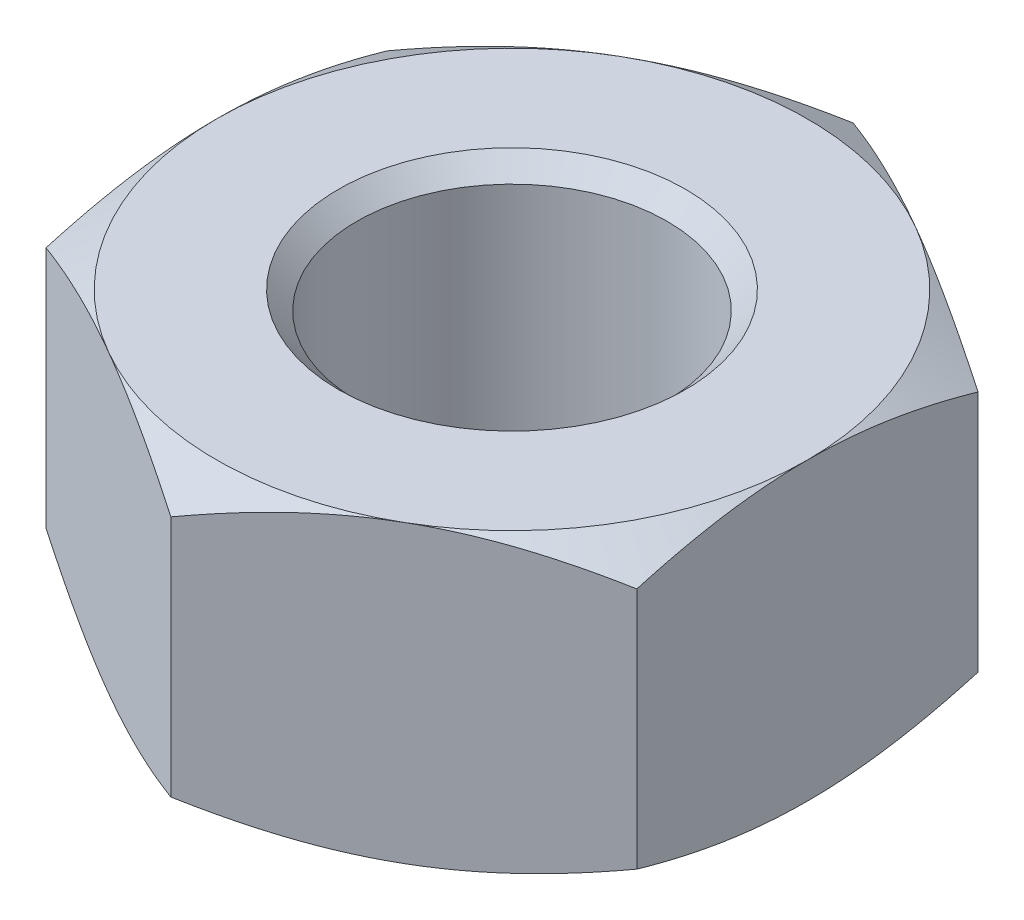
ISO-10303-21;
HEADER;
FILE_DESCRIPTION(('STEP AP214'),'2;1');
FILE_NAME('part.step','',(''),(''),'','','');
FILE_SCHEMA(('AUTOMOTIVE_DESIGN { 1 0 10303 214 1 1 1 1 }'));
ENDSEC;
DATA;
#1=APPLICATION_CONTEXT('core data for automotive mechanical design processes');
#2=APPLICATION_PROTOCOL_DEFINITION('international standard','automotive_design',2000,#1);
#3=PRODUCT_CONTEXT('',#1,'mechanical');
#4=PRODUCT('Part','Part','',(#3));
#5=PRODUCT_RELATED_PRODUCT_CATEGORY('part','',(#4));
#6=PRODUCT_DEFINITION_FORMATION('','',#4);
#7=PRODUCT_DEFINITION_CONTEXT('part definition',#1,'design');
#8=PRODUCT_DEFINITION('design','',#6,#7);
#9=PRODUCT_DEFINITION_SHAPE('','',#8);
#10=(LENGTH_UNIT() NAMED_UNIT(*) SI_UNIT(.MILLI.,.METRE.));
#11=(NAMED_UNIT(*) PLANE_ANGLE_UNIT() SI_UNIT($,.RADIAN.));
#12=(NAMED_UNIT(*) SI_UNIT($,.STERADIAN.) SOLID_ANGLE_UNIT());
#13=UNCERTAINTY_MEASURE_WITH_UNIT(LENGTH_MEASURE(1.E-05),#10,'distance_accuracy_value','');
#14=(GEOMETRIC_REPRESENTATION_CONTEXT(3) GLOBAL_UNCERTAINTY_ASSIGNED_CONTEXT((#13)) GLOBAL_UNIT_ASSIGNED_CONTEXT((#10,
#11,#12)) REPRESENTATION_CONTEXT('',''));
#15=CARTESIAN_POINT('',(0.,0.,0.));
#16=DIRECTION('',(0.,0.,1.));
#17=DIRECTION('',(1.,0.,0.));
#18=AXIS2_PLACEMENT_3D('',#15,#16,#17);
#19=CARTESIAN_POINT('',(0.,-2.,0.));
#20=DIRECTION('',(0.,1.,0.));
#21=DIRECTION('',(0.,0.,1.));
#22=AXIS2_PLACEMENT_3D('',#19,#20,#21);
#23=PLANE('',#22);
#24=CARTESIAN_POINT('',(0.,-2.,0.));
#25=DIRECTION('',(0.,1.,0.));
#26=DIRECTION('',(0.,0.,1.));
#27=AXIS2_PLACEMENT_3D('',#24,#25,#26);
#28=CIRCLE('',#27,2.35);
#29=CARTESIAN_POINT('',(0.,-2.,2.35));
#30=VERTEX_POINT('',#29);
#31=EDGE_CURVE('E12',#30,#30,#28,.T.);
#32=ORIENTED_EDGE('',*,*,#31,.T.);
#33=EDGE_LOOP('',(#32));
#34=FACE_BOUND('',#33,.T.);
#35=CARTESIAN_POINT('',(0.,-2.,0.));
#36=DIRECTION('',(0.,1.,0.));
#37=DIRECTION('',(0.,0.,1.));
#38=AXIS2_PLACEMENT_3D('',#35,#36,#37);
#39=CIRCLE('',#38,4.);
#40=CARTESIAN_POINT('',(2.,-2.,3.46410161513776));
#41=VERTEX_POINT('',#40);
#42=CARTESIAN_POINT('',(-2.,-2.,3.46410161513776));
#43=VERTEX_POINT('',#42);
#44=EDGE_CURVE('E139',#41,#43,#39,.F.);
#45=ORIENTED_EDGE('',*,*,#44,.T.);
#46=CARTESIAN_POINT('',(-4.,-2.,0.));
#47=VERTEX_POINT('',#46);
#48=EDGE_CURVE('E52',#43,#47,#39,.F.);
#49=ORIENTED_EDGE('',*,*,#48,.T.);
#50=CARTESIAN_POINT('',(-2.,-2.,-3.46410161513776));
#51=VERTEX_POINT('',#50);
#52=EDGE_CURVE('E378',#47,#51,#39,.F.);
#53=ORIENTED_EDGE('',*,*,#52,.T.);
#54=CARTESIAN_POINT('',(2.,-2.,-3.46410161513776));
#55=VERTEX_POINT('',#54);
#56=EDGE_CURVE('E380',#51,#55,#39,.F.);
#57=ORIENTED_EDGE('',*,*,#56,.T.);
#58=CARTESIAN_POINT('',(4.,-2.,0.));
#59=VERTEX_POINT('',#58);
#60=EDGE_CURVE('E144',#55,#59,#39,.F.);
#61=ORIENTED_EDGE('',*,*,#60,.T.);
#62=CARTESIAN_POINT('',(0.,-2.,0.));
#63=DIRECTION('',(0.,1.,0.));
#64=DIRECTION('',(0.,0.,1.));
#65=AXIS2_PLACEMENT_3D('',#62,#63,#64);
#66=CIRCLE('',#65,4.);
#67=EDGE_CURVE('E130',#41,#59,#66,.T.);
#68=ORIENTED_EDGE('',*,*,#67,.F.);
#69=EDGE_LOOP('',(#45,#49,#53,#57,#61,#68));
#70=FACE_BOUND('',#69,.T.);
#71=ADVANCED_FACE('F37',(#34,#70),#23,.F.);
#72=CARTESIAN_POINT('',(0.,2.,4.61880215351701));
#73=DIRECTION('',(-0.5,0.,-0.866025403784439));
#74=DIRECTION('',(-0.866025403784439,0.,0.5));
#75=AXIS2_PLACEMENT_3D('',#72,#73,#74);
#76=PLANE('',#75);
#77=DIRECTION('',(0.,-1.,0.));
#78=VECTOR('',#77,1.);
#79=CARTESIAN_POINT('',(0.,2.,4.61880215351701));
#80=LINE('',#79,#78);
#81=CARTESIAN_POINT('',(0.,1.64273441009184,4.61880215351701));
#82=VERTEX_POINT('',#81);
#83=CARTESIAN_POINT('',(0.,-1.64273441009184,4.61880215351701));
#84=VERTEX_POINT('',#83);
#85=EDGE_CURVE('E154',#82,#84,#80,.T.);
#86=ORIENTED_EDGE('',*,*,#85,.T.);
#87=CARTESIAN_POINT('',(-0.000200000000001885,-1.64266774092524,4.61891762357084));
#88=CARTESIAN_POINT('',(0.175579150323226,-1.70128212635172,4.5174314838138));
#89=CARTESIAN_POINT('',(0.352875616326379,-1.75458967853774,4.41506932144052));
#90=CARTESIAN_POINT('',(0.710538593175705,-1.8476383292536,4.20857250547739));
#91=CARTESIAN_POINT('',(0.89091145897015,-1.8873465109703,4.10443418285647));
#92=CARTESIAN_POINT('',(1.24942181870279,-1.94915778471972,3.89744813015756));
#93=CARTESIAN_POINT('',(1.42750415293514,-1.97167226847711,3.79463224655059));
#94=CARTESIAN_POINT('',(1.78450671716651,-1.99854937685342,3.58851671999023));
#95=CARTESIAN_POINT('',(1.9634256496441,-2.00293425857306,3.48521782616117));
#96=CARTESIAN_POINT('',(2.29774284219673,-1.99380992706003,3.29219970504619));
#97=CARTESIAN_POINT('',(2.45319115998706,-1.98254104601201,3.20245157692486));
#98=CARTESIAN_POINT('',(2.76307505563505,-1.94682600920181,3.02354002635497));
#99=CARTESIAN_POINT('',(2.91750956174413,-1.92236765428847,2.93437722268073));
#100=CARTESIAN_POINT('',(3.22803232777458,-1.86122393508071,2.75509682012354));
#101=CARTESIAN_POINT('',(3.3840812880631,-1.82427939634514,2.6650019108942));
#102=CARTESIAN_POINT('',(3.69385183540384,-1.74042992745198,2.48615580200001));
#103=CARTESIAN_POINT('',(3.84757739077378,-1.69354469778726,2.39740231122585));
#104=CARTESIAN_POINT('',(4.0002,-1.64266774092524,2.30928560670467));
#105=B_SPLINE_CURVE_WITH_KNOTS('',3,(#87,#88,#89,#90,#91,#92,#93,#94,#95,#96,#97,#98,#99,#100,
#101,#102,#103,#104),.UNSPECIFIED.,.F.,.F.,(4,2,2,2,2,2,2,2,4),(0.,0.634047835695966,
1.26961969224543,1.88946157213122,2.50854226669297,3.04757825393386,3.58711366126903,
4.13861653143764,4.68903648037743),.UNSPECIFIED.);
#106=EDGE_CURVE('E59',#84,#41,#105,.T.);
#107=ORIENTED_EDGE('',*,*,#106,.T.);
#108=CARTESIAN_POINT('',(4.,-1.64273441009184,2.3094010767585));
#109=VERTEX_POINT('',#108);
#110=EDGE_CURVE('E127',#41,#109,#105,.T.);
#111=ORIENTED_EDGE('',*,*,#110,.T.);
#112=DIRECTION('',(0.,-1.,0.));
#113=VECTOR('',#112,1.);
#114=CARTESIAN_POINT('',(4.,2.,2.3094010767585));
#115=LINE('',#114,#113);
#116=CARTESIAN_POINT('',(4.,1.64273441009184,2.3094010767585));
#117=VERTEX_POINT('',#116);
#118=EDGE_CURVE('E271',#117,#109,#115,.T.);
#119=ORIENTED_EDGE('',*,*,#118,.F.);
#120=CARTESIAN_POINT('',(-0.000200000000001885,1.64266774092524,4.61891762357084));
#121=CARTESIAN_POINT('',(0.175579150323226,1.70128212635172,4.5174314838138));
#122=CARTESIAN_POINT('',(0.352875616326379,1.75458967853774,4.41506932144052));
#123=CARTESIAN_POINT('',(0.710538593175705,1.8476383292536,4.20857250547739));
#124=CARTESIAN_POINT('',(0.89091145897015,1.8873465109703,4.10443418285647));
#125=CARTESIAN_POINT('',(1.24942181870279,1.94915778471972,3.89744813015756));
#126=CARTESIAN_POINT('',(1.42750415293514,1.97167226847711,3.79463224655059));
#127=CARTESIAN_POINT('',(1.78450671716651,1.99854937685342,3.58851671999023));
#128=CARTESIAN_POINT('',(1.9634256496441,2.00293425857306,3.48521782616117));
#129=CARTESIAN_POINT('',(2.29774284219673,1.99380992706003,3.29219970504619));
#130=CARTESIAN_POINT('',(2.45319115998706,1.98254104601201,3.20245157692486));
#131=CARTESIAN_POINT('',(2.76307505563505,1.94682600920181,3.02354002635497));
#132=CARTESIAN_POINT('',(2.91750956174413,1.92236765428847,2.93437722268073));
#133=CARTESIAN_POINT('',(3.22803232777458,1.86122393508071,2.75509682012354));
#134=CARTESIAN_POINT('',(3.3840812880631,1.82427939634514,2.6650019108942));
#135=CARTESIAN_POINT('',(3.69385183540384,1.74042992745198,2.48615580200001));
#136=CARTESIAN_POINT('',(3.84757739077378,1.69354469778726,2.39740231122585));
#137=CARTESIAN_POINT('',(4.0002,1.64266774092524,2.30928560670467));
#138=B_SPLINE_CURVE_WITH_KNOTS('',3,(#120,#121,#122,#123,#124,#125,#126,#127,#128,#129,#130,
#131,#132,#133,#134,#135,#136,#137),.UNSPECIFIED.,.F.,.F.,(4,2,2,2,2,2,2,2,4),(0.,
0.634047835695966,1.26961969224543,1.88946157213122,2.50854226669297,3.04757825393386,
3.58711366126903,4.13861653143764,4.68903648037743),.UNSPECIFIED.);
#139=CARTESIAN_POINT('',(2.,2.,3.46410161513776));
#140=VERTEX_POINT('',#139);
#141=EDGE_CURVE('E251',#140,#117,#138,.T.);
#142=ORIENTED_EDGE('',*,*,#141,.F.);
#143=EDGE_CURVE('E257',#82,#140,#138,.T.);
#144=ORIENTED_EDGE('',*,*,#143,.F.);
#145=EDGE_LOOP('',(#86,#107,#111,#119,#142,#144));
#146=FACE_BOUND('',#145,.T.);
#147=ADVANCED_FACE('F151',(#146),#76,.F.);
#148=CARTESIAN_POINT('',(4.,2.,2.3094010767585));
#149=DIRECTION('',(-1.,0.,0.));
#150=DIRECTION('',(0.,0.,1.));
#151=AXIS2_PLACEMENT_3D('',#148,#149,#150);
#152=PLANE('',#151);
#153=ORIENTED_EDGE('',*,*,#118,.T.);
#154=CARTESIAN_POINT('',(4.,-0.0288542223267847,-6.24253507150389));
#155=CARTESIAN_POINT('',(4.,-0.113932360173933,-6.06747206509902));
#156=CARTESIAN_POINT('',(4.,-0.198205906980998,-5.89201132590408));
#157=CARTESIAN_POINT('',(4.,-0.364691993563113,-5.54008297283565));
#158=CARTESIAN_POINT('',(4.,-0.446904215874516,-5.36361520894607));
#159=CARTESIAN_POINT('',(4.,-0.609220945666707,-5.00857114987515));
#160=CARTESIAN_POINT('',(4.,-0.689311882579765,-4.82998862940935));
#161=CARTESIAN_POINT('',(4.,-0.846267397209191,-4.47141657824296));
#162=CARTESIAN_POINT('',(4.,-0.923132124891703,-4.29142711340472));
#163=CARTESIAN_POINT('',(4.,-1.07522952536281,-3.92384616443088));
#164=CARTESIAN_POINT('',(4.,-1.15032689852421,-3.7361983930778));
#165=CARTESIAN_POINT('',(4.,-1.29493231386766,-3.35872213784876));
#166=CARTESIAN_POINT('',(4.,-1.36443973451876,-3.16889341415324));
#167=CARTESIAN_POINT('',(4.,-1.49606961885141,-2.78709584094415));
#168=CARTESIAN_POINT('',(4.,-1.55820668604455,-2.59513207659198));
#169=CARTESIAN_POINT('',(4.,-1.67312812474441,-2.20845128581282));
#170=CARTESIAN_POINT('',(4.,-1.72591539966408,-2.0137351344438));
#171=CARTESIAN_POINT('',(4.,-1.81935351833355,-1.6225019178267));
#172=CARTESIAN_POINT('',(4.,-1.86007006897343,-1.42600083705216));
#173=CARTESIAN_POINT('',(4.,-1.92708402717112,-1.03051476063685));
#174=CARTESIAN_POINT('',(4.,-1.95338291457808,-0.831530022067316));
#175=CARTESIAN_POINT('',(4.,-1.98912096625145,-0.434686694884085));
#176=CARTESIAN_POINT('',(4.,-1.99878004048414,-0.236848411456635));
#177=CARTESIAN_POINT('',(4.,-2.0010009605766,0.158943217594613));
#178=CARTESIAN_POINT('',(4.,-1.99356243628645,0.356896565616715));
#179=CARTESIAN_POINT('',(4.,-1.96704714718947,0.691762992040419));
#180=CARTESIAN_POINT('',(4.,-1.95217079755403,0.829029781375152));
#181=CARTESIAN_POINT('',(4.,-1.91510141134919,1.10257847106215));
#182=CARTESIAN_POINT('',(4.,-1.89290741586688,1.23886023994309));
#183=CARTESIAN_POINT('',(4.,-1.81651344468562,1.64603164488815));
#184=CARTESIAN_POINT('',(4.,-1.75251433417763,1.91510432935792));
#185=CARTESIAN_POINT('',(4.,-1.64126323703023,2.3175841123597));
#186=CARTESIAN_POINT('',(4.,-1.60109736714564,2.45306878133937));
#187=CARTESIAN_POINT('',(4.,-1.51652881434346,2.72272209792349));
#188=CARTESIAN_POINT('',(4.,-1.47212610040033,2.85689073588298));
#189=CARTESIAN_POINT('',(4.,-1.37980195299892,3.12395458210447));
#190=CARTESIAN_POINT('',(4.,-1.3318816020757,3.25685016802699));
#191=CARTESIAN_POINT('',(4.,-1.23309257979872,3.52153454606914));
#192=CARTESIAN_POINT('',(4.,-1.18222396528534,3.6533233594705));
#193=CARTESIAN_POINT('',(4.,-1.04642408116184,3.9955719317597));
#194=CARTESIAN_POINT('',(4.,-0.959548443520246,4.20525929426535));
#195=CARTESIAN_POINT('',(4.,-0.781004518977472,4.62259071558223));
#196=CARTESIAN_POINT('',(4.,-0.689335783404014,4.83023458093631));
#197=CARTESIAN_POINT('',(4.,-0.502296658272443,5.24391797809677));
#198=CARTESIAN_POINT('',(4.,-0.406925169492595,5.44995701134881));
#199=CARTESIAN_POINT('',(4.,-0.213320613355933,5.86068894916052));
#200=CARTESIAN_POINT('',(4.,-0.11508746719928,6.06538181646098));
#201=CARTESIAN_POINT('',(4.,0.0837750759036593,6.4739539423094));
#202=CARTESIAN_POINT('',(4.,0.184407646290331,6.67783165326032));
#203=CARTESIAN_POINT('',(4.,0.387488026314039,7.08468191049784));
#204=CARTESIAN_POINT('',(4.,0.489935854160734,7.28765444767865));
#205=CARTESIAN_POINT('',(4.,0.799426691521053,7.89537895520692));
#206=CARTESIAN_POINT('',(4.,1.00865600616322,8.29901710933171));
#207=CARTESIAN_POINT('',(4.,1.41006314245613,9.06418978171575));
#208=CARTESIAN_POINT('',(4.,1.60186825842617,9.42592074679159));
#209=CARTESIAN_POINT('',(4.,1.98784897807196,10.1481395650377));
#210=CARTESIAN_POINT('',(4.,2.18202470630567,10.508627351601));
#211=CARTESIAN_POINT('',(4.,2.57154509729339,11.2275405531627));
#212=CARTESIAN_POINT('',(4.,2.76688435231235,11.5859689027755));
#213=CARTESIAN_POINT('',(4.,3.15892632596351,12.3020466558963));
#214=CARTESIAN_POINT('',(4.,3.35562894757915,12.6596961124975));
#215=CARTESIAN_POINT('',(4.,3.55283076312019,13.0170683532049));
#216=B_SPLINE_CURVE_WITH_KNOTS('',3,(#154,#155,#156,#157,#158,#159,#160,#161,#162,#163,#164,
#165,#166,#167,#168,#169,#170,#171,#172,#173,#174,#175,#176,#177,#178,#179,#180,#181,#182,#183,
#184,#185,#186,#187,#188,#189,#190,#191,#192,#193,#194,#195,#196,#197,#198,#199,#200,#201,#202,
#203,#204,#205,#206,#207,#208,#209,#210,#211,#212,#213,#214,#215),.UNSPECIFIED.,.F.,.F.,(4,2,2,
2,2,2,2,2,2,2,2,2,2,2,2,2,2,2,2,2,2,2,2,2,2,2,2,2,2,2,4),(0.,0.58393170000972,1.16795278544889,
1.75508687723558,2.34219364656264,2.94847593937228,3.55482555005801,4.15995293622641,
4.76489208005435,5.36647508549512,5.9679963320474,6.56150514935765,7.15502681580017,
7.5690384845873,7.98310442752669,8.81166523046238,9.23556757547245,9.65947302487097,
10.0832485620448,10.5070159318504,11.1878442978326,11.8687365092864,12.5498324237317,
13.2309471108908,13.9130189642329,14.5950976636207,15.9589900745708,17.1872914028076,
18.4156575492536,19.6402583263854,20.8647728382852),.UNSPECIFIED.);
#217=EDGE_CURVE('E133',#109,#59,#216,.F.);
#218=ORIENTED_EDGE('',*,*,#217,.T.);
#219=CARTESIAN_POINT('',(4.,-1.64273441009184,-2.30940107675851));
#220=VERTEX_POINT('',#219);
#221=EDGE_CURVE('E166',#59,#220,#216,.F.);
#222=ORIENTED_EDGE('',*,*,#221,.T.);
#223=DIRECTION('',(0.,-1.,0.));
#224=VECTOR('',#223,1.);
#225=CARTESIAN_POINT('',(4.,2.,-2.30940107675851));
#226=LINE('',#225,#224);
#227=CARTESIAN_POINT('',(4.,1.64273441009184,-2.30940107675851));
#228=VERTEX_POINT('',#227);
#229=EDGE_CURVE('E268',#228,#220,#226,.T.);
#230=ORIENTED_EDGE('',*,*,#229,.F.);
#231=CARTESIAN_POINT('',(4.,0.0288542223267847,-6.24253507150389));
#232=CARTESIAN_POINT('',(4.,0.113932360173933,-6.06747206509902));
#233=CARTESIAN_POINT('',(4.,0.198205906980998,-5.89201132590408));
#234=CARTESIAN_POINT('',(4.,0.364691993563113,-5.54008297283565));
#235=CARTESIAN_POINT('',(4.,0.446904215874516,-5.36361520894607));
#236=CARTESIAN_POINT('',(4.,0.609220945666707,-5.00857114987515));
#237=CARTESIAN_POINT('',(4.,0.689311882579765,-4.82998862940935));
#238=CARTESIAN_POINT('',(4.,0.846267397209191,-4.47141657824296));
#239=CARTESIAN_POINT('',(4.,0.923132124891703,-4.29142711340472));
#240=CARTESIAN_POINT('',(4.,1.07522952536281,-3.92384616443088));
#241=CARTESIAN_POINT('',(4.,1.15032689852421,-3.7361983930778));
#242=CARTESIAN_POINT('',(4.,1.29493231386766,-3.35872213784876));
#243=CARTESIAN_POINT('',(4.,1.36443973451876,-3.16889341415324));
#244=CARTESIAN_POINT('',(4.,1.49606961885141,-2.78709584094415));
#245=CARTESIAN_POINT('',(4.,1.55820668604455,-2.59513207659198));
#246=CARTESIAN_POINT('',(4.,1.67312812474441,-2.20845128581282));
#247=CARTESIAN_POINT('',(4.,1.72591539966408,-2.0137351344438));
#248=CARTESIAN_POINT('',(4.,1.81935351833355,-1.6225019178267));
#249=CARTESIAN_POINT('',(4.,1.86007006897343,-1.42600083705216));
#250=CARTESIAN_POINT('',(4.,1.92708402717112,-1.03051476063685));
#251=CARTESIAN_POINT('',(4.,1.95338291457808,-0.831530022067316));
#252=CARTESIAN_POINT('',(4.,1.98912096625145,-0.434686694884085));
#253=CARTESIAN_POINT('',(4.,1.99878004048414,-0.236848411456635));
#254=CARTESIAN_POINT('',(4.,2.0010009605766,0.158943217594613));
#255=CARTESIAN_POINT('',(4.,1.99356243628645,0.356896565616715));
#256=CARTESIAN_POINT('',(4.,1.96704714718947,0.691762992040419));
#257=CARTESIAN_POINT('',(4.,1.95217079755403,0.829029781375152));
#258=CARTESIAN_POINT('',(4.,1.91510141134919,1.10257847106215));
#259=CARTESIAN_POINT('',(4.,1.89290741586688,1.23886023994309));
#260=CARTESIAN_POINT('',(4.,1.81651344468562,1.64603164488815));
#261=CARTESIAN_POINT('',(4.,1.75251433417763,1.91510432935792));
#262=CARTESIAN_POINT('',(4.,1.64126323703023,2.3175841123597));
#263=CARTESIAN_POINT('',(4.,1.60109736714564,2.45306878133937));
#264=CARTESIAN_POINT('',(4.,1.51652881434346,2.72272209792349));
#265=CARTESIAN_POINT('',(4.,1.47212610040033,2.85689073588298));
#266=CARTESIAN_POINT('',(4.,1.37980195299892,3.12395458210447));
#267=CARTESIAN_POINT('',(4.,1.3318816020757,3.25685016802699));
#268=CARTESIAN_POINT('',(4.,1.23309257979872,3.52153454606914));
#269=CARTESIAN_POINT('',(4.,1.18222396528534,3.6533233594705));
#270=CARTESIAN_POINT('',(4.,1.04642408116184,3.9955719317597));
#271=CARTESIAN_POINT('',(4.,0.959548443520246,4.20525929426535));
#272=CARTESIAN_POINT('',(4.,0.781004518977472,4.62259071558223));
#273=CARTESIAN_POINT('',(4.,0.689335783404014,4.83023458093631));
#274=CARTESIAN_POINT('',(4.,0.502296658272443,5.24391797809677));
#275=CARTESIAN_POINT('',(4.,0.406925169492595,5.44995701134881));
#276=CARTESIAN_POINT('',(4.,0.213320613355933,5.86068894916052));
#277=CARTESIAN_POINT('',(4.,0.11508746719928,6.06538181646098));
#278=CARTESIAN_POINT('',(4.,-0.0837750759036593,6.4739539423094));
#279=CARTESIAN_POINT('',(4.,-0.184407646290331,6.67783165326032));
#280=CARTESIAN_POINT('',(4.,-0.387488026314039,7.08468191049784));
#281=CARTESIAN_POINT('',(4.,-0.489935854160734,7.28765444767865));
#282=CARTESIAN_POINT('',(4.,-0.799426691521053,7.89537895520692));
#283=CARTESIAN_POINT('',(4.,-1.00865600616322,8.29901710933171));
#284=CARTESIAN_POINT('',(4.,-1.41006314245613,9.06418978171575));
#285=CARTESIAN_POINT('',(4.,-1.60186825842617,9.42592074679159));
#286=CARTESIAN_POINT('',(4.,-1.98784897807196,10.1481395650377));
#287=CARTESIAN_POINT('',(4.,-2.18202470630567,10.508627351601));
#288=CARTESIAN_POINT('',(4.,-2.57154509729339,11.2275405531627));
#289=CARTESIAN_POINT('',(4.,-2.76688435231235,11.5859689027755));
#290=CARTESIAN_POINT('',(4.,-3.15892632596351,12.3020466558963));
#291=CARTESIAN_POINT('',(4.,-3.35562894757915,12.6596961124975));
#292=CARTESIAN_POINT('',(4.,-3.55283076312019,13.0170683532049));
#293=B_SPLINE_CURVE_WITH_KNOTS('',3,(#231,#232,#233,#234,#235,#236,#237,#238,#239,#240,#241,
#242,#243,#244,#245,#246,#247,#248,#249,#250,#251,#252,#253,#254,#255,#256,#257,#258,#259,#260,
#261,#262,#263,#264,#265,#266,#267,#268,#269,#270,#271,#272,#273,#274,#275,#276,#277,#278,#279,
#280,#281,#282,#283,#284,#285,#286,#287,#288,#289,#290,#291,#292),.UNSPECIFIED.,.F.,.F.,(4,2,2,
2,2,2,2,2,2,2,2,2,2,2,2,2,2,2,2,2,2,2,2,2,2,2,2,2,2,2,4),(0.,0.58393170000972,1.16795278544889,
1.75508687723558,2.34219364656264,2.94847593937228,3.55482555005801,4.15995293622641,
4.76489208005435,5.36647508549512,5.9679963320474,6.56150514935765,7.15502681580017,
7.5690384845873,7.98310442752669,8.81166523046238,9.23556757547245,9.65947302487097,
10.0832485620448,10.5070159318504,11.1878442978326,11.8687365092864,12.5498324237317,
13.2309471108908,13.9130189642329,14.5950976636207,15.9589900745708,17.1872914028076,
18.4156575492536,19.6402583263854,20.8647728382852),.UNSPECIFIED.);
#294=CARTESIAN_POINT('',(4.,2.,0.));
#295=VERTEX_POINT('',#294);
#296=EDGE_CURVE('E244',#295,#228,#293,.F.);
#297=ORIENTED_EDGE('',*,*,#296,.F.);
#298=EDGE_CURVE('E250',#117,#295,#293,.F.);
#299=ORIENTED_EDGE('',*,*,#298,.F.);
#300=EDGE_LOOP('',(#153,#218,#222,#230,#297,#299));
#301=FACE_BOUND('',#300,.T.);
#302=ADVANCED_FACE('F223',(#301),#152,.F.);
#303=CARTESIAN_POINT('',(4.,2.,-2.30940107675851));
#304=DIRECTION('',(-0.5,0.,0.866025403784439));
#305=DIRECTION('',(0.866025403784439,0.,0.5));
#306=AXIS2_PLACEMENT_3D('',#303,#304,#305);
#307=PLANE('',#306);
#308=ORIENTED_EDGE('',*,*,#229,.T.);
#309=CARTESIAN_POINT('',(4.0002,-1.64266774092524,-2.30928560670467));
#310=CARTESIAN_POINT('',(3.82442084967677,-1.70128212635172,-2.41077174646171));
#311=CARTESIAN_POINT('',(3.64712438367362,-1.75458967853774,-2.513133908835));
#312=CARTESIAN_POINT('',(3.28946140682429,-1.8476383292536,-2.71963072479812));
#313=CARTESIAN_POINT('',(3.10908854102985,-1.8873465109703,-2.82376904741905));
#314=CARTESIAN_POINT('',(2.75057818129721,-1.94915778471972,-3.03075510011795));
#315=CARTESIAN_POINT('',(2.57249584706486,-1.97167226847711,-3.13357098372492));
#316=CARTESIAN_POINT('',(2.21549328283349,-1.99854937685342,-3.33968651028529));
#317=CARTESIAN_POINT('',(2.0365743503559,-2.00293425857306,-3.44298540411434));
#318=CARTESIAN_POINT('',(1.70225715780327,-1.99380992706003,-3.63600352522933));
#319=CARTESIAN_POINT('',(1.54680884001293,-1.98254104601201,-3.72575165335065));
#320=CARTESIAN_POINT('',(1.23692494436494,-1.94682600920181,-3.90466320392055));
#321=CARTESIAN_POINT('',(1.08249043825587,-1.92236765428847,-3.99382600759479));
#322=CARTESIAN_POINT('',(0.771967672225422,-1.86122393508071,-4.17310641015197));
#323=CARTESIAN_POINT('',(0.615918711936898,-1.82427939634514,-4.26320131938131));
#324=CARTESIAN_POINT('',(0.306148164596162,-1.74042992745197,-4.44204742827551));
#325=CARTESIAN_POINT('',(0.152422609226222,-1.69354469778726,-4.53080091904966));
#326=CARTESIAN_POINT('',(-0.000199999999998291,-1.64266774092523,-4.61891762357085));
#327=B_SPLINE_CURVE_WITH_KNOTS('',3,(#309,#310,#311,#312,#313,#314,#315,#316,#317,#318,#319,
#320,#321,#322,#323,#324,#325,#326),.UNSPECIFIED.,.F.,.F.,(4,2,2,2,2,2,2,2,4),(0.,
0.634047835695966,1.26961969224543,1.88946157213122,2.50854226669297,3.04757825393386,
3.58711366126903,4.13861653143763,4.68903648037743),.UNSPECIFIED.);
#328=EDGE_CURVE('E217',#220,#55,#327,.T.);
#329=ORIENTED_EDGE('',*,*,#328,.T.);
#330=CARTESIAN_POINT('',(0.,-1.64273441009184,-4.61880215351701));
#331=VERTEX_POINT('',#330);
#332=EDGE_CURVE('E210',#55,#331,#327,.T.);
#333=ORIENTED_EDGE('',*,*,#332,.T.);
#334=DIRECTION('',(0.,-1.,0.));
#335=VECTOR('',#334,1.);
#336=CARTESIAN_POINT('',(0.,2.,-4.61880215351701));
#337=LINE('',#336,#335);
#338=CARTESIAN_POINT('',(0.,1.64273441009184,-4.61880215351701));
#339=VERTEX_POINT('',#338);
#340=EDGE_CURVE('E265',#339,#331,#337,.T.);
#341=ORIENTED_EDGE('',*,*,#340,.F.);
#342=CARTESIAN_POINT('',(4.0002,1.64266774092524,-2.30928560670467));
#343=CARTESIAN_POINT('',(3.82442084967677,1.70128212635172,-2.41077174646171));
#344=CARTESIAN_POINT('',(3.64712438367362,1.75458967853774,-2.513133908835));
#345=CARTESIAN_POINT('',(3.28946140682429,1.8476383292536,-2.71963072479812));
#346=CARTESIAN_POINT('',(3.10908854102985,1.8873465109703,-2.82376904741905));
#347=CARTESIAN_POINT('',(2.75057818129721,1.94915778471972,-3.03075510011795));
#348=CARTESIAN_POINT('',(2.57249584706486,1.97167226847711,-3.13357098372492));
#349=CARTESIAN_POINT('',(2.21549328283349,1.99854937685342,-3.33968651028529));
#350=CARTESIAN_POINT('',(2.0365743503559,2.00293425857306,-3.44298540411434));
#351=CARTESIAN_POINT('',(1.70225715780327,1.99380992706003,-3.63600352522933));
#352=CARTESIAN_POINT('',(1.54680884001293,1.98254104601201,-3.72575165335065));
#353=CARTESIAN_POINT('',(1.23692494436494,1.94682600920181,-3.90466320392055));
#354=CARTESIAN_POINT('',(1.08249043825587,1.92236765428847,-3.99382600759479));
#355=CARTESIAN_POINT('',(0.771967672225422,1.86122393508071,-4.17310641015197));
#356=CARTESIAN_POINT('',(0.615918711936898,1.82427939634514,-4.26320131938131));
#357=CARTESIAN_POINT('',(0.306148164596162,1.74042992745197,-4.44204742827551));
#358=CARTESIAN_POINT('',(0.152422609226222,1.69354469778726,-4.53080091904966));
#359=CARTESIAN_POINT('',(-0.000199999999998291,1.64266774092523,-4.61891762357085));
#360=B_SPLINE_CURVE_WITH_KNOTS('',3,(#342,#343,#344,#345,#346,#347,#348,#349,#350,#351,#352,
#353,#354,#355,#356,#357,#358,#359),.UNSPECIFIED.,.F.,.F.,(4,2,2,2,2,2,2,2,4),(0.,
0.634047835695966,1.26961969224543,1.88946157213122,2.50854226669297,3.04757825393386,
3.58711366126903,4.13861653143763,4.68903648037743),.UNSPECIFIED.);
#361=CARTESIAN_POINT('',(2.,2.,-3.46410161513776));
#362=VERTEX_POINT('',#361);
#363=EDGE_CURVE('E229',#362,#339,#360,.T.);
#364=ORIENTED_EDGE('',*,*,#363,.F.);
#365=EDGE_CURVE('E236',#228,#362,#360,.T.);
#366=ORIENTED_EDGE('',*,*,#365,.F.);
#367=EDGE_LOOP('',(#308,#329,#333,#341,#364,#366));
#368=FACE_BOUND('',#367,.T.);
#369=ADVANCED_FACE('F219',(#368),#307,.F.);
#370=CARTESIAN_POINT('',(0.,2.,-4.61880215351701));
#371=DIRECTION('',(0.5,0.,0.866025403784439));
#372=DIRECTION('',(0.866025403784439,0.,-0.5));
#373=AXIS2_PLACEMENT_3D('',#370,#371,#372);
#374=PLANE('',#373);
#375=ORIENTED_EDGE('',*,*,#340,.T.);
#376=CARTESIAN_POINT('',(0.000200000000001413,-1.64266774092523,-4.61891762357085));
#377=CARTESIAN_POINT('',(-0.175579150323227,-1.70128212635172,-4.51743148381381));
#378=CARTESIAN_POINT('',(-0.35287561632638,-1.75458967853774,-4.41506932144052));
#379=CARTESIAN_POINT('',(-0.710538593175706,-1.8476383292536,-4.2085725054774));
#380=CARTESIAN_POINT('',(-0.89091145897015,-1.8873465109703,-4.10443418285647));
#381=CARTESIAN_POINT('',(-1.24942181870279,-1.94915778471972,-3.89744813015756));
#382=CARTESIAN_POINT('',(-1.42750415293514,-1.97167226847711,-3.79463224655059));
#383=CARTESIAN_POINT('',(-1.78450671716651,-1.99854937685342,-3.58851671999023));
#384=CARTESIAN_POINT('',(-1.9634256496441,-2.00293425857306,-3.48521782616117));
#385=CARTESIAN_POINT('',(-2.29774284219673,-1.99380992706003,-3.29219970504619));
#386=CARTESIAN_POINT('',(-2.45319115998707,-1.98254104601201,-3.20245157692487));
#387=CARTESIAN_POINT('',(-2.76307505563506,-1.94682600920181,-3.02354002635497));
#388=CARTESIAN_POINT('',(-2.91750956174413,-1.92236765428847,-2.93437722268073));
#389=CARTESIAN_POINT('',(-3.22803232777458,-1.86122393508071,-2.75509682012354));
#390=CARTESIAN_POINT('',(-3.3840812880631,-1.82427939634514,-2.6650019108942));
#391=CARTESIAN_POINT('',(-3.69385183540384,-1.74042992745197,-2.48615580200001));
#392=CARTESIAN_POINT('',(-3.84757739077378,-1.69354469778726,-2.39740231122585));
#393=CARTESIAN_POINT('',(-4.0002,-1.64266774092523,-2.30928560670467));
#394=B_SPLINE_CURVE_WITH_KNOTS('',3,(#376,#377,#378,#379,#380,#381,#382,#383,#384,#385,#386,
#387,#388,#389,#390,#391,#392,#393),.UNSPECIFIED.,.F.,.F.,(4,2,2,2,2,2,2,2,4),(0.,
0.634047835695966,1.26961969224543,1.88946157213122,2.50854226669297,3.04757825393386,
3.58711366126904,4.13861653143764,4.68903648037743),.UNSPECIFIED.);
#395=EDGE_CURVE('E218',#331,#51,#394,.T.);
#396=ORIENTED_EDGE('',*,*,#395,.T.);
#397=CARTESIAN_POINT('',(-4.,-1.6427344100921,-2.30940107675889));
#398=VERTEX_POINT('',#397);
#399=EDGE_CURVE('E204',#51,#398,#394,.T.);
#400=ORIENTED_EDGE('',*,*,#399,.T.);
#401=DIRECTION('',(0.,-1.,0.));
#402=VECTOR('',#401,1.);
#403=CARTESIAN_POINT('',(-4.,2.,-2.3094010767585));
#404=LINE('',#403,#402);
#405=CARTESIAN_POINT('',(-4.,1.6427344100921,-2.30940107675889));
#406=VERTEX_POINT('',#405);
#407=EDGE_CURVE('E262',#406,#398,#404,.T.);
#408=ORIENTED_EDGE('',*,*,#407,.F.);
#409=CARTESIAN_POINT('',(0.000200000000001413,1.64266774092523,-4.61891762357085));
#410=CARTESIAN_POINT('',(-0.175579150323227,1.70128212635172,-4.51743148381381));
#411=CARTESIAN_POINT('',(-0.35287561632638,1.75458967853774,-4.41506932144052));
#412=CARTESIAN_POINT('',(-0.710538593175706,1.8476383292536,-4.2085725054774));
#413=CARTESIAN_POINT('',(-0.89091145897015,1.8873465109703,-4.10443418285647));
#414=CARTESIAN_POINT('',(-1.24942181870279,1.94915778471972,-3.89744813015756));
#415=CARTESIAN_POINT('',(-1.42750415293514,1.97167226847711,-3.79463224655059));
#416=CARTESIAN_POINT('',(-1.78450671716651,1.99854937685342,-3.58851671999023));
#417=CARTESIAN_POINT('',(-1.9634256496441,2.00293425857306,-3.48521782616117));
#418=CARTESIAN_POINT('',(-2.29774284219673,1.99380992706003,-3.29219970504619));
#419=CARTESIAN_POINT('',(-2.45319115998707,1.98254104601201,-3.20245157692487));
#420=CARTESIAN_POINT('',(-2.76307505563506,1.94682600920181,-3.02354002635497));
#421=CARTESIAN_POINT('',(-2.91750956174413,1.92236765428847,-2.93437722268073));
#422=CARTESIAN_POINT('',(-3.22803232777458,1.86122393508071,-2.75509682012354));
#423=CARTESIAN_POINT('',(-3.3840812880631,1.82427939634514,-2.6650019108942));
#424=CARTESIAN_POINT('',(-3.69385183540384,1.74042992745197,-2.48615580200001));
#425=CARTESIAN_POINT('',(-3.84757739077378,1.69354469778726,-2.39740231122585));
#426=CARTESIAN_POINT('',(-4.0002,1.64266774092523,-2.30928560670467));
#427=B_SPLINE_CURVE_WITH_KNOTS('',3,(#409,#410,#411,#412,#413,#414,#415,#416,#417,#418,#419,
#420,#421,#422,#423,#424,#425,#426),.UNSPECIFIED.,.F.,.F.,(4,2,2,2,2,2,2,2,4),(0.,
0.634047835695966,1.26961969224543,1.88946157213122,2.50854226669297,3.04757825393386,
3.58711366126904,4.13861653143764,4.68903648037743),.UNSPECIFIED.);
#428=CARTESIAN_POINT('',(-2.,2.,-3.46410161513776));
#429=VERTEX_POINT('',#428);
#430=EDGE_CURVE('E238',#429,#406,#427,.T.);
#431=ORIENTED_EDGE('',*,*,#430,.F.);
#432=EDGE_CURVE('E237',#339,#429,#427,.T.);
#433=ORIENTED_EDGE('',*,*,#432,.F.);
#434=EDGE_LOOP('',(#375,#396,#400,#408,#431,#433));
#435=FACE_BOUND('',#434,.T.);
#436=ADVANCED_FACE('F222',(#435),#374,.F.);
#437=CARTESIAN_POINT('',(-4.,2.,-2.3094010767585));
#438=DIRECTION('',(1.,0.,0.));
#439=DIRECTION('',(0.,0.,-1.));
#440=AXIS2_PLACEMENT_3D('',#437,#438,#439);
#441=PLANE('',#440);
#442=ORIENTED_EDGE('',*,*,#407,.T.);
#443=CARTESIAN_POINT('',(-4.,-0.0288542223267843,-6.2425350715039));
#444=CARTESIAN_POINT('',(-4.,-0.113932360173932,-6.06747206509902));
#445=CARTESIAN_POINT('',(-4.,-0.198205906980997,-5.89201132590408));
#446=CARTESIAN_POINT('',(-4.,-0.364691993563113,-5.54008297283565));
#447=CARTESIAN_POINT('',(-4.,-0.446904215874516,-5.36361520894607));
#448=CARTESIAN_POINT('',(-4.,-0.609220945666706,-5.00857114987515));
#449=CARTESIAN_POINT('',(-4.,-0.689311882579764,-4.82998862940935));
#450=CARTESIAN_POINT('',(-4.,-0.84626739720919,-4.47141657824296));
#451=CARTESIAN_POINT('',(-4.,-0.923132124891702,-4.29142711340472));
#452=CARTESIAN_POINT('',(-4.,-1.07522952536281,-3.92384616443088));
#453=CARTESIAN_POINT('',(-4.,-1.15032689852421,-3.7361983930778));
#454=CARTESIAN_POINT('',(-4.,-1.29493231386766,-3.35872213784876));
#455=CARTESIAN_POINT('',(-4.,-1.36443973451876,-3.16889341415324));
#456=CARTESIAN_POINT('',(-4.,-1.49606961885141,-2.78709584094415));
#457=CARTESIAN_POINT('',(-4.,-1.55820668604455,-2.59513207659198));
#458=CARTESIAN_POINT('',(-4.,-1.6731281247444,-2.20845128581281));
#459=CARTESIAN_POINT('',(-4.,-1.72591539966407,-2.0137351344438));
#460=CARTESIAN_POINT('',(-4.,-1.81935351833355,-1.6225019178267));
#461=CARTESIAN_POINT('',(-4.,-1.86007006897343,-1.42600083705216));
#462=CARTESIAN_POINT('',(-4.,-1.92708402717112,-1.03051476063685));
#463=CARTESIAN_POINT('',(-4.,-1.95338291457808,-0.831530022067314));
#464=CARTESIAN_POINT('',(-4.,-1.98912096625145,-0.434686694884083));
#465=CARTESIAN_POINT('',(-4.,-1.99878004048414,-0.236848411456632));
#466=CARTESIAN_POINT('',(-4.,-2.0010009605766,0.158943217594615));
#467=CARTESIAN_POINT('',(-4.,-1.99356243628645,0.356896565616717));
#468=CARTESIAN_POINT('',(-4.,-1.96704714718947,0.691762992040421));
#469=CARTESIAN_POINT('',(-4.,-1.95217079755403,0.829029781375154));
#470=CARTESIAN_POINT('',(-4.,-1.91510141134919,1.10257847106216));
#471=CARTESIAN_POINT('',(-4.,-1.89290741586687,1.2388602399431));
#472=CARTESIAN_POINT('',(-4.,-1.81651344468562,1.64603164488815));
#473=CARTESIAN_POINT('',(-4.,-1.75251433417763,1.91510432935793));
#474=CARTESIAN_POINT('',(-4.,-1.64126323703023,2.31758411235971));
#475=CARTESIAN_POINT('',(-4.,-1.60109736714563,2.45306878133937));
#476=CARTESIAN_POINT('',(-4.,-1.51652881434345,2.72272209792349));
#477=CARTESIAN_POINT('',(-4.,-1.47212610040032,2.85689073588298));
#478=CARTESIAN_POINT('',(-4.,-1.37980195299892,3.12395458210448));
#479=CARTESIAN_POINT('',(-4.,-1.3318816020757,3.256850168027));
#480=CARTESIAN_POINT('',(-4.,-1.23309257979872,3.52153454606915));
#481=CARTESIAN_POINT('',(-4.,-1.18222396528533,3.6533233594705));
#482=CARTESIAN_POINT('',(-4.,-1.04642408116183,3.9955719317597));
#483=CARTESIAN_POINT('',(-4.,-0.959548443520243,4.20525929426535));
#484=CARTESIAN_POINT('',(-4.,-0.781004518977468,4.62259071558224));
#485=CARTESIAN_POINT('',(-4.,-0.68933578340401,4.83023458093632));
#486=CARTESIAN_POINT('',(-4.,-0.502296658272439,5.24391797809677));
#487=CARTESIAN_POINT('',(-4.,-0.406925169492591,5.44995701134881));
#488=CARTESIAN_POINT('',(-4.,-0.213320613355929,5.86068894916053));
#489=CARTESIAN_POINT('',(-4.,-0.115087467199275,6.06538181646099));
#490=CARTESIAN_POINT('',(-4.,0.0837750759036638,6.47395394230941));
#491=CARTESIAN_POINT('',(-4.,0.184407646290335,6.67783165326032));
#492=CARTESIAN_POINT('',(-4.,0.387488026314043,7.08468191049784));
#493=CARTESIAN_POINT('',(-4.,0.489935854160738,7.28765444767865));
#494=CARTESIAN_POINT('',(-4.,0.799426691521056,7.89537895520693));
#495=CARTESIAN_POINT('',(-4.,1.00865600616323,8.29901710933172));
#496=CARTESIAN_POINT('',(-4.,1.41006314245613,9.06418978171576));
#497=CARTESIAN_POINT('',(-4.,1.60186825842617,9.4259207467916));
#498=CARTESIAN_POINT('',(-4.,1.98784897807197,10.1481395650377));
#499=CARTESIAN_POINT('',(-4.,2.18202470630567,10.508627351601));
#500=CARTESIAN_POINT('',(-4.,2.5715450972934,11.2275405531627));
#501=CARTESIAN_POINT('',(-4.,2.76688435231235,11.5859689027755));
#502=CARTESIAN_POINT('',(-4.,3.15892632596351,12.3020466558963));
#503=CARTESIAN_POINT('',(-4.,3.35562894757916,12.6596961124975));
#504=CARTESIAN_POINT('',(-4.,3.5528307631202,13.0170683532049));
#505=B_SPLINE_CURVE_WITH_KNOTS('',3,(#443,#444,#445,#446,#447,#448,#449,#450,#451,#452,#453,
#454,#455,#456,#457,#458,#459,#460,#461,#462,#463,#464,#465,#466,#467,#468,#469,#470,#471,#472,
#473,#474,#475,#476,#477,#478,#479,#480,#481,#482,#483,#484,#485,#486,#487,#488,#489,#490,#491,
#492,#493,#494,#495,#496,#497,#498,#499,#500,#501,#502,#503,#504),.UNSPECIFIED.,.F.,.F.,(4,2,2,
2,2,2,2,2,2,2,2,2,2,2,2,2,2,2,2,2,2,2,2,2,2,2,2,2,2,2,4),(0.,0.583931700009721,1.16795278544889,
1.75508687723558,2.34219364656264,2.94847593937228,3.55482555005801,4.15995293622641,
4.76489208005435,5.36647508549513,5.9679963320474,6.56150514935765,7.15502681580017,
7.5690384845873,7.9831044275267,8.81166523046239,9.23556757547246,9.65947302487098,
10.0832485620448,10.5070159318504,11.1878442978326,11.8687365092864,12.5498324237317,
13.2309471108908,13.9130189642329,14.5950976636207,15.9589900745708,17.1872914028076,
18.4156575492536,19.6402583263854,20.8647728382852),.UNSPECIFIED.);
#506=EDGE_CURVE('E374',#398,#47,#505,.T.);
#507=ORIENTED_EDGE('',*,*,#506,.T.);
#508=CARTESIAN_POINT('',(-4.,-1.64273441009184,2.3094010767585));
#509=VERTEX_POINT('',#508);
#510=EDGE_CURVE('E197',#47,#509,#505,.T.);
#511=ORIENTED_EDGE('',*,*,#510,.T.);
#512=DIRECTION('',(0.,-1.,0.));
#513=VECTOR('',#512,1.);
#514=CARTESIAN_POINT('',(-4.,2.,2.3094010767585));
#515=LINE('',#514,#513);
#516=CARTESIAN_POINT('',(-4.,1.64273441009184,2.3094010767585));
#517=VERTEX_POINT('',#516);
#518=EDGE_CURVE('E259',#517,#509,#515,.T.);
#519=ORIENTED_EDGE('',*,*,#518,.F.);
#520=CARTESIAN_POINT('',(-4.,0.0288542223267843,-6.2425350715039));
#521=CARTESIAN_POINT('',(-4.,0.113932360173932,-6.06747206509902));
#522=CARTESIAN_POINT('',(-4.,0.198205906980997,-5.89201132590408));
#523=CARTESIAN_POINT('',(-4.,0.364691993563113,-5.54008297283565));
#524=CARTESIAN_POINT('',(-4.,0.446904215874516,-5.36361520894607));
#525=CARTESIAN_POINT('',(-4.,0.609220945666706,-5.00857114987515));
#526=CARTESIAN_POINT('',(-4.,0.689311882579764,-4.82998862940935));
#527=CARTESIAN_POINT('',(-4.,0.84626739720919,-4.47141657824296));
#528=CARTESIAN_POINT('',(-4.,0.923132124891702,-4.29142711340472));
#529=CARTESIAN_POINT('',(-4.,1.07522952536281,-3.92384616443088));
#530=CARTESIAN_POINT('',(-4.,1.15032689852421,-3.7361983930778));
#531=CARTESIAN_POINT('',(-4.,1.29493231386766,-3.35872213784876));
#532=CARTESIAN_POINT('',(-4.,1.36443973451876,-3.16889341415324));
#533=CARTESIAN_POINT('',(-4.,1.49606961885141,-2.78709584094415));
#534=CARTESIAN_POINT('',(-4.,1.55820668604455,-2.59513207659198));
#535=CARTESIAN_POINT('',(-4.,1.6731281247444,-2.20845128581281));
#536=CARTESIAN_POINT('',(-4.,1.72591539966407,-2.0137351344438));
#537=CARTESIAN_POINT('',(-4.,1.81935351833355,-1.6225019178267));
#538=CARTESIAN_POINT('',(-4.,1.86007006897343,-1.42600083705216));
#539=CARTESIAN_POINT('',(-4.,1.92708402717112,-1.03051476063685));
#540=CARTESIAN_POINT('',(-4.,1.95338291457808,-0.831530022067314));
#541=CARTESIAN_POINT('',(-4.,1.98912096625145,-0.434686694884083));
#542=CARTESIAN_POINT('',(-4.,1.99878004048414,-0.236848411456632));
#543=CARTESIAN_POINT('',(-4.,2.0010009605766,0.158943217594615));
#544=CARTESIAN_POINT('',(-4.,1.99356243628645,0.356896565616717));
#545=CARTESIAN_POINT('',(-4.,1.96704714718947,0.691762992040421));
#546=CARTESIAN_POINT('',(-4.,1.95217079755403,0.829029781375154));
#547=CARTESIAN_POINT('',(-4.,1.91510141134919,1.10257847106216));
#548=CARTESIAN_POINT('',(-4.,1.89290741586687,1.2388602399431));
#549=CARTESIAN_POINT('',(-4.,1.81651344468562,1.64603164488815));
#550=CARTESIAN_POINT('',(-4.,1.75251433417763,1.91510432935793));
#551=CARTESIAN_POINT('',(-4.,1.64126323703023,2.31758411235971));
#552=CARTESIAN_POINT('',(-4.,1.60109736714563,2.45306878133937));
#553=CARTESIAN_POINT('',(-4.,1.51652881434345,2.72272209792349));
#554=CARTESIAN_POINT('',(-4.,1.47212610040032,2.85689073588298));
#555=CARTESIAN_POINT('',(-4.,1.37980195299892,3.12395458210448));
#556=CARTESIAN_POINT('',(-4.,1.3318816020757,3.256850168027));
#557=CARTESIAN_POINT('',(-4.,1.23309257979872,3.52153454606915));
#558=CARTESIAN_POINT('',(-4.,1.18222396528533,3.6533233594705));
#559=CARTESIAN_POINT('',(-4.,1.04642408116183,3.9955719317597));
#560=CARTESIAN_POINT('',(-4.,0.959548443520243,4.20525929426535));
#561=CARTESIAN_POINT('',(-4.,0.781004518977468,4.62259071558224));
#562=CARTESIAN_POINT('',(-4.,0.68933578340401,4.83023458093632));
#563=CARTESIAN_POINT('',(-4.,0.502296658272439,5.24391797809677));
#564=CARTESIAN_POINT('',(-4.,0.406925169492591,5.44995701134881));
#565=CARTESIAN_POINT('',(-4.,0.213320613355929,5.86068894916053));
#566=CARTESIAN_POINT('',(-4.,0.115087467199275,6.06538181646099));
#567=CARTESIAN_POINT('',(-4.,-0.0837750759036638,6.47395394230941));
#568=CARTESIAN_POINT('',(-4.,-0.184407646290335,6.67783165326032));
#569=CARTESIAN_POINT('',(-4.,-0.387488026314043,7.08468191049784));
#570=CARTESIAN_POINT('',(-4.,-0.489935854160738,7.28765444767865));
#571=CARTESIAN_POINT('',(-4.,-0.799426691521056,7.89537895520693));
#572=CARTESIAN_POINT('',(-4.,-1.00865600616323,8.29901710933172));
#573=CARTESIAN_POINT('',(-4.,-1.41006314245613,9.06418978171576));
#574=CARTESIAN_POINT('',(-4.,-1.60186825842617,9.4259207467916));
#575=CARTESIAN_POINT('',(-4.,-1.98784897807197,10.1481395650377));
#576=CARTESIAN_POINT('',(-4.,-2.18202470630567,10.508627351601));
#577=CARTESIAN_POINT('',(-4.,-2.5715450972934,11.2275405531627));
#578=CARTESIAN_POINT('',(-4.,-2.76688435231235,11.5859689027755));
#579=CARTESIAN_POINT('',(-4.,-3.15892632596351,12.3020466558963));
#580=CARTESIAN_POINT('',(-4.,-3.35562894757916,12.6596961124975));
#581=CARTESIAN_POINT('',(-4.,-3.5528307631202,13.0170683532049));
#582=B_SPLINE_CURVE_WITH_KNOTS('',3,(#520,#521,#522,#523,#524,#525,#526,#527,#528,#529,#530,
#531,#532,#533,#534,#535,#536,#537,#538,#539,#540,#541,#542,#543,#544,#545,#546,#547,#548,#549,
#550,#551,#552,#553,#554,#555,#556,#557,#558,#559,#560,#561,#562,#563,#564,#565,#566,#567,#568,
#569,#570,#571,#572,#573,#574,#575,#576,#577,#578,#579,#580,#581),.UNSPECIFIED.,.F.,.F.,(4,2,2,
2,2,2,2,2,2,2,2,2,2,2,2,2,2,2,2,2,2,2,2,2,2,2,2,2,2,2,4),(0.,0.583931700009721,1.16795278544889,
1.75508687723558,2.34219364656264,2.94847593937228,3.55482555005801,4.15995293622641,
4.76489208005435,5.36647508549513,5.9679963320474,6.56150514935765,7.15502681580017,
7.5690384845873,7.9831044275267,8.81166523046239,9.23556757547246,9.65947302487098,
10.0832485620448,10.5070159318504,11.1878442978326,11.8687365092864,12.5498324237317,
13.2309471108908,13.9130189642329,14.5950976636207,15.9589900745708,17.1872914028076,
18.4156575492536,19.6402583263854,20.8647728382852),.UNSPECIFIED.);
#583=CARTESIAN_POINT('',(-4.,2.,0.));
#584=VERTEX_POINT('',#583);
#585=EDGE_CURVE('E319',#584,#517,#582,.T.);
#586=ORIENTED_EDGE('',*,*,#585,.F.);
#587=EDGE_CURVE('E324',#406,#584,#582,.T.);
#588=ORIENTED_EDGE('',*,*,#587,.F.);
#589=EDGE_LOOP('',(#442,#507,#511,#519,#586,#588));
#590=FACE_BOUND('',#589,.T.);
#591=ADVANCED_FACE('F310',(#590),#441,.F.);
#592=CARTESIAN_POINT('',(-4.,2.,2.3094010767585));
#593=DIRECTION('',(0.5,0.,-0.866025403784439));
#594=DIRECTION('',(-0.866025403784439,0.,-0.5));
#595=AXIS2_PLACEMENT_3D('',#592,#593,#594);
#596=PLANE('',#595);
#597=ORIENTED_EDGE('',*,*,#518,.T.);
#598=CARTESIAN_POINT('',(-4.0002,-1.64266774092523,2.30928560670466));
#599=CARTESIAN_POINT('',(-3.82442084967677,-1.70128212635172,2.4107717464617));
#600=CARTESIAN_POINT('',(-3.64712438367362,-1.75458967853774,2.51313390883499));
#601=CARTESIAN_POINT('',(-3.28946140682429,-1.8476383292536,2.71963072479811));
#602=CARTESIAN_POINT('',(-3.10908854102985,-1.8873465109703,2.82376904741904));
#603=CARTESIAN_POINT('',(-2.75057818129721,-1.94915778471972,3.03075510011795));
#604=CARTESIAN_POINT('',(-2.57249584706486,-1.97167226847711,3.13357098372492));
#605=CARTESIAN_POINT('',(-2.21549328283349,-1.99854937685342,3.33968651028528));
#606=CARTESIAN_POINT('',(-2.0365743503559,-2.00293425857306,3.44298540411434));
#607=CARTESIAN_POINT('',(-1.70225715780327,-1.99380992706003,3.63600352522932));
#608=CARTESIAN_POINT('',(-1.54680884001294,-1.98254104601201,3.72575165335065));
#609=CARTESIAN_POINT('',(-1.23692494436495,-1.94682600920181,3.90466320392054));
#610=CARTESIAN_POINT('',(-1.08249043825587,-1.92236765428847,3.99382600759478));
#611=CARTESIAN_POINT('',(-0.771967672225423,-1.86122393508071,4.17310641015197));
#612=CARTESIAN_POINT('',(-0.615918711936899,-1.82427939634514,4.26320131938131));
#613=CARTESIAN_POINT('',(-0.306148164596162,-1.74042992745198,4.4420474282755));
#614=CARTESIAN_POINT('',(-0.152422609226222,-1.69354469778726,4.53080091904966));
#615=CARTESIAN_POINT('',(0.000199999999998031,-1.64266774092524,4.61891762357084));
#616=B_SPLINE_CURVE_WITH_KNOTS('',3,(#598,#599,#600,#601,#602,#603,#604,#605,#606,#607,#608,
#609,#610,#611,#612,#613,#614,#615),.UNSPECIFIED.,.F.,.F.,(4,2,2,2,2,2,2,2,4),(0.,
0.634047835695966,1.26961969224543,1.88946157213122,2.50854226669297,3.04757825393386,
3.58711366126903,4.13861653143764,4.68903648037743),.UNSPECIFIED.);
#617=EDGE_CURVE('E376',#509,#43,#616,.T.);
#618=ORIENTED_EDGE('',*,*,#617,.T.);
#619=EDGE_CURVE('E141',#43,#84,#616,.T.);
#620=ORIENTED_EDGE('',*,*,#619,.T.);
#621=ORIENTED_EDGE('',*,*,#85,.F.);
#622=CARTESIAN_POINT('',(-4.0002,1.64266774092523,2.30928560670466));
#623=CARTESIAN_POINT('',(-3.82442084967677,1.70128212635172,2.4107717464617));
#624=CARTESIAN_POINT('',(-3.64712438367362,1.75458967853774,2.51313390883499));
#625=CARTESIAN_POINT('',(-3.28946140682429,1.8476383292536,2.71963072479811));
#626=CARTESIAN_POINT('',(-3.10908854102985,1.8873465109703,2.82376904741904));
#627=CARTESIAN_POINT('',(-2.75057818129721,1.94915778471972,3.03075510011795));
#628=CARTESIAN_POINT('',(-2.57249584706486,1.97167226847711,3.13357098372492));
#629=CARTESIAN_POINT('',(-2.21549328283349,1.99854937685342,3.33968651028528));
#630=CARTESIAN_POINT('',(-2.0365743503559,2.00293425857306,3.44298540411434));
#631=CARTESIAN_POINT('',(-1.70225715780327,1.99380992706003,3.63600352522932));
#632=CARTESIAN_POINT('',(-1.54680884001294,1.98254104601201,3.72575165335065));
#633=CARTESIAN_POINT('',(-1.23692494436495,1.94682600920181,3.90466320392054));
#634=CARTESIAN_POINT('',(-1.08249043825587,1.92236765428847,3.99382600759478));
#635=CARTESIAN_POINT('',(-0.771967672225423,1.86122393508071,4.17310641015197));
#636=CARTESIAN_POINT('',(-0.615918711936899,1.82427939634514,4.26320131938131));
#637=CARTESIAN_POINT('',(-0.306148164596162,1.74042992745198,4.4420474282755));
#638=CARTESIAN_POINT('',(-0.152422609226222,1.69354469778726,4.53080091904966));
#639=CARTESIAN_POINT('',(0.000199999999998031,1.64266774092524,4.61891762357084));
#640=B_SPLINE_CURVE_WITH_KNOTS('',3,(#622,#623,#624,#625,#626,#627,#628,#629,#630,#631,#632,
#633,#634,#635,#636,#637,#638,#639),.UNSPECIFIED.,.F.,.F.,(4,2,2,2,2,2,2,2,4),(0.,
0.634047835695966,1.26961969224543,1.88946157213122,2.50854226669297,3.04757825393386,
3.58711366126903,4.13861653143764,4.68903648037743),.UNSPECIFIED.);
#641=CARTESIAN_POINT('',(-2.,2.,3.46410161513775));
#642=VERTEX_POINT('',#641);
#643=EDGE_CURVE('E157',#642,#82,#640,.T.);
#644=ORIENTED_EDGE('',*,*,#643,.F.);
#645=EDGE_CURVE('E318',#517,#642,#640,.T.);
#646=ORIENTED_EDGE('',*,*,#645,.F.);
#647=EDGE_LOOP('',(#597,#618,#620,#621,#644,#646));
#648=FACE_BOUND('',#647,.T.);
#649=ADVANCED_FACE('F307',(#648),#596,.F.);
#650=CARTESIAN_POINT('',(0.,2.,0.));
#651=DIRECTION('',(0.,-1.,0.));
#652=DIRECTION('',(0.,0.,1.));
#653=AXIS2_PLACEMENT_3D('',#650,#651,#652);
#654=CONICAL_SURFACE('',#653,4.,1.0471975511966);
#655=ORIENTED_EDGE('',*,*,#143,.T.);
#656=CARTESIAN_POINT('',(0.,2.,0.));
#657=DIRECTION('',(0.,1.,0.));
#658=DIRECTION('',(0.,0.,1.));
#659=AXIS2_PLACEMENT_3D('',#656,#657,#658);
#660=CIRCLE('',#659,4.);
#661=EDGE_CURVE('E273',#642,#140,#660,.T.);
#662=ORIENTED_EDGE('',*,*,#661,.F.);
#663=ORIENTED_EDGE('',*,*,#643,.T.);
#664=EDGE_LOOP('',(#655,#662,#663));
#665=FACE_BOUND('',#664,.T.);
#666=ADVANCED_FACE('F182',(#665),#654,.T.);
#667=ORIENTED_EDGE('',*,*,#585,.T.);
#668=ORIENTED_EDGE('',*,*,#645,.T.);
#669=EDGE_CURVE('E275',#584,#642,#660,.T.);
#670=ORIENTED_EDGE('',*,*,#669,.F.);
#671=EDGE_LOOP('',(#667,#668,#670));
#672=FACE_BOUND('',#671,.T.);
#673=ADVANCED_FACE('F331',(#672),#654,.T.);
#674=ORIENTED_EDGE('',*,*,#430,.T.);
#675=ORIENTED_EDGE('',*,*,#587,.T.);
#676=EDGE_CURVE('E367',#429,#584,#660,.T.);
#677=ORIENTED_EDGE('',*,*,#676,.F.);
#678=EDGE_LOOP('',(#674,#675,#677));
#679=FACE_BOUND('',#678,.T.);
#680=ADVANCED_FACE('F366',(#679),#654,.T.);
#681=ORIENTED_EDGE('',*,*,#363,.T.);
#682=ORIENTED_EDGE('',*,*,#432,.T.);
#683=EDGE_CURVE('E359',#362,#429,#660,.T.);
#684=ORIENTED_EDGE('',*,*,#683,.F.);
#685=EDGE_LOOP('',(#681,#682,#684));
#686=FACE_BOUND('',#685,.T.);
#687=ADVANCED_FACE('F356',(#686),#654,.T.);
#688=ORIENTED_EDGE('',*,*,#296,.T.);
#689=ORIENTED_EDGE('',*,*,#365,.T.);
#690=EDGE_CURVE('E145',#295,#362,#660,.T.);
#691=ORIENTED_EDGE('',*,*,#690,.F.);
#692=EDGE_LOOP('',(#688,#689,#691));
#693=FACE_BOUND('',#692,.T.);
#694=ADVANCED_FACE('F348',(#693),#654,.T.);
#695=ORIENTED_EDGE('',*,*,#141,.T.);
#696=ORIENTED_EDGE('',*,*,#298,.T.);
#697=CARTESIAN_POINT('',(0.,2.,0.));
#698=DIRECTION('',(0.,1.,0.));
#699=DIRECTION('',(0.,0.,1.));
#700=AXIS2_PLACEMENT_3D('',#697,#698,#699);
#701=CIRCLE('',#700,4.);
#702=EDGE_CURVE('E155',#140,#295,#701,.T.);
#703=ORIENTED_EDGE('',*,*,#702,.F.);
#704=EDGE_LOOP('',(#695,#696,#703));
#705=FACE_BOUND('',#704,.T.);
#706=ADVANCED_FACE('F340',(#705),#654,.T.);
#707=CARTESIAN_POINT('',(0.,2.,0.));
#708=DIRECTION('',(0.,1.,0.));
#709=DIRECTION('',(0.,0.,1.));
#710=AXIS2_PLACEMENT_3D('',#707,#708,#709);
#711=PLANE('',#710);
#712=CARTESIAN_POINT('',(0.,2.,0.));
#713=DIRECTION('',(0.,1.,0.));
#714=DIRECTION('',(0.,0.,1.));
#715=AXIS2_PLACEMENT_3D('',#712,#713,#714);
#716=CIRCLE('',#715,2.35);
#717=CARTESIAN_POINT('',(0.,2.,2.35));
#718=VERTEX_POINT('',#717);
#719=EDGE_CURVE('E45',#718,#718,#716,.F.);
#720=ORIENTED_EDGE('',*,*,#719,.T.);
#721=EDGE_LOOP('',(#720));
#722=FACE_BOUND('',#721,.T.);
#723=ORIENTED_EDGE('',*,*,#661,.T.);
#724=ORIENTED_EDGE('',*,*,#702,.T.);
#725=ORIENTED_EDGE('',*,*,#690,.T.);
#726=ORIENTED_EDGE('',*,*,#683,.T.);
#727=ORIENTED_EDGE('',*,*,#676,.T.);
#728=ORIENTED_EDGE('',*,*,#669,.T.);
#729=EDGE_LOOP('',(#723,#724,#725,#726,#727,#728));
#730=FACE_BOUND('',#729,.T.);
#731=ADVANCED_FACE('F179',(#722,#730),#711,.T.);
#732=CARTESIAN_POINT('',(0.,-2.,0.));
#733=DIRECTION('',(0.,1.,0.));
#734=DIRECTION('',(0.,0.,1.));
#735=AXIS2_PLACEMENT_3D('',#732,#733,#734);
#736=CONICAL_SURFACE('',#735,4.,1.0471975511966);
#737=ORIENTED_EDGE('',*,*,#619,.F.);
#738=ORIENTED_EDGE('',*,*,#44,.F.);
#739=ORIENTED_EDGE('',*,*,#106,.F.);
#740=EDGE_LOOP('',(#737,#738,#739));
#741=FACE_BOUND('',#740,.T.);
#742=ADVANCED_FACE('F140',(#741),#736,.T.);
#743=ORIENTED_EDGE('',*,*,#67,.T.);
#744=ORIENTED_EDGE('',*,*,#217,.F.);
#745=ORIENTED_EDGE('',*,*,#110,.F.);
#746=EDGE_LOOP('',(#743,#744,#745));
#747=FACE_BOUND('',#746,.T.);
#748=ADVANCED_FACE('F128',(#747),#736,.T.);
#749=ORIENTED_EDGE('',*,*,#60,.F.);
#750=ORIENTED_EDGE('',*,*,#328,.F.);
#751=ORIENTED_EDGE('',*,*,#221,.F.);
#752=EDGE_LOOP('',(#749,#750,#751));
#753=FACE_BOUND('',#752,.T.);
#754=ADVANCED_FACE('F383',(#753),#736,.T.);
#755=ORIENTED_EDGE('',*,*,#56,.F.);
#756=ORIENTED_EDGE('',*,*,#395,.F.);
#757=ORIENTED_EDGE('',*,*,#332,.F.);
#758=EDGE_LOOP('',(#755,#756,#757));
#759=FACE_BOUND('',#758,.T.);
#760=ADVANCED_FACE('F385',(#759),#736,.T.);
#761=ORIENTED_EDGE('',*,*,#52,.F.);
#762=ORIENTED_EDGE('',*,*,#506,.F.);
#763=ORIENTED_EDGE('',*,*,#399,.F.);
#764=EDGE_LOOP('',(#761,#762,#763));
#765=FACE_BOUND('',#764,.T.);
#766=ADVANCED_FACE('F379',(#765),#736,.T.);
#767=ORIENTED_EDGE('',*,*,#48,.F.);
#768=ORIENTED_EDGE('',*,*,#617,.F.);
#769=ORIENTED_EDGE('',*,*,#510,.F.);
#770=EDGE_LOOP('',(#767,#768,#769));
#771=FACE_BOUND('',#770,.T.);
#772=ADVANCED_FACE('F180',(#771),#736,.T.);
#773=CARTESIAN_POINT('',(0.,-2.,0.));
#774=DIRECTION('',(0.,-1.,0.));
#775=DIRECTION('',(0.,0.,-1.));
#776=AXIS2_PLACEMENT_3D('',#773,#774,#775);
#777=CYLINDRICAL_SURFACE('',#776,2.1);
#778=CARTESIAN_POINT('',(0.,1.75,0.));
#779=DIRECTION('',(0.,1.,0.));
#780=DIRECTION('',(0.,0.,1.));
#781=AXIS2_PLACEMENT_3D('',#778,#779,#780);
#782=CIRCLE('',#781,2.1);
#783=CARTESIAN_POINT('',(0.,1.75,2.1));
#784=VERTEX_POINT('',#783);
#785=EDGE_CURVE('E280',#784,#784,#782,.T.);
#786=ORIENTED_EDGE('',*,*,#785,.T.);
#787=EDGE_LOOP('',(#786));
#788=FACE_BOUND('',#787,.T.);
#789=CARTESIAN_POINT('',(0.,-1.75,0.));
#790=DIRECTION('',(0.,1.,0.));
#791=DIRECTION('',(0.,0.,1.));
#792=AXIS2_PLACEMENT_3D('',#789,#790,#791);
#793=CIRCLE('',#792,2.1);
#794=CARTESIAN_POINT('',(0.,-1.75,2.1));
#795=VERTEX_POINT('',#794);
#796=EDGE_CURVE('E277',#795,#795,#793,.F.);
#797=ORIENTED_EDGE('',*,*,#796,.T.);
#798=EDGE_LOOP('',(#797));
#799=FACE_BOUND('',#798,.T.);
#800=ADVANCED_FACE('F181',(#788,#799),#777,.F.);
#801=CARTESIAN_POINT('',(0.,1.75,0.));
#802=DIRECTION('',(0.,1.,0.));
#803=DIRECTION('',(0.,0.,1.));
#804=AXIS2_PLACEMENT_3D('',#801,#802,#803);
#805=CONICAL_SURFACE('',#804,2.1,0.785398163397452);
#806=ORIENTED_EDGE('',*,*,#719,.F.);
#807=EDGE_LOOP('',(#806));
#808=FACE_BOUND('',#807,.T.);
#809=ORIENTED_EDGE('',*,*,#785,.F.);
#810=EDGE_LOOP('',(#809));
#811=FACE_BOUND('',#810,.T.);
#812=ADVANCED_FACE('F287',(#808,#811),#805,.F.);
#813=CARTESIAN_POINT('',(0.,-1.75,0.));
#814=DIRECTION('',(0.,-1.,0.));
#815=DIRECTION('',(0.,0.,-1.));
#816=AXIS2_PLACEMENT_3D('',#813,#814,#815);
#817=CONICAL_SURFACE('',#816,2.1,0.785398163397452);
#818=ORIENTED_EDGE('',*,*,#31,.F.);
#819=EDGE_LOOP('',(#818));
#820=FACE_BOUND('',#819,.T.);
#821=ORIENTED_EDGE('',*,*,#796,.F.);
#822=EDGE_LOOP('',(#821));
#823=FACE_BOUND('',#822,.T.);
#824=ADVANCED_FACE('F39',(#820,#823),#817,.F.);
#825=CLOSED_SHELL('',(#71,#147,#302,#369,#436,#591,#649,#666,#673,#680,#687,#694,#706,#731,#742,
#748,#754,#760,#766,#772,#800,#812,#824));
#826=MANIFOLD_SOLID_BREP('B2',#825);
#827=ADVANCED_BREP_SHAPE_REPRESENTATION('',(#18,#826),#14);
#828=SHAPE_DEFINITION_REPRESENTATION(#9,#827);
ENDSEC;
END-ISO-10303-21;
